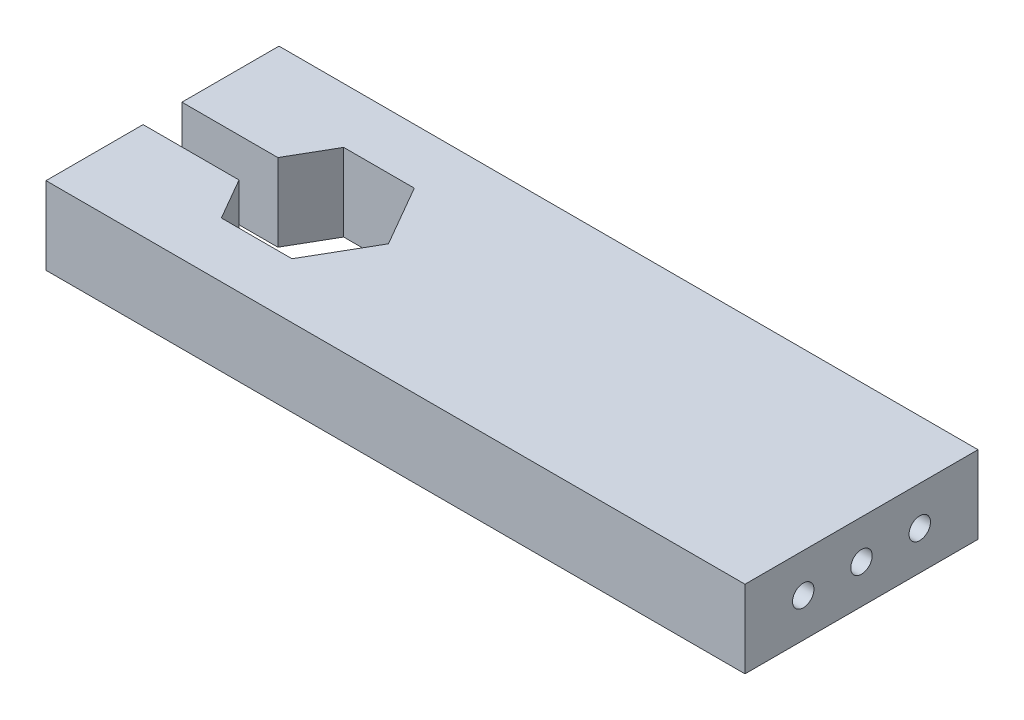
ISO-10303-21;
HEADER;
FILE_DESCRIPTION(('STEP AP214'),'2;1');
FILE_NAME('part.step','',(''),(''),'','','');
FILE_SCHEMA(('AUTOMOTIVE_DESIGN { 1 0 10303 214 1 1 1 1 }'));
ENDSEC;
DATA;
#1=APPLICATION_CONTEXT('core data for automotive mechanical design processes');
#2=APPLICATION_PROTOCOL_DEFINITION('international standard','automotive_design',2000,#1);
#3=PRODUCT_CONTEXT('',#1,'mechanical');
#4=PRODUCT('Part','Part','',(#3));
#5=PRODUCT_RELATED_PRODUCT_CATEGORY('part','',(#4));
#6=PRODUCT_DEFINITION_FORMATION('','',#4);
#7=PRODUCT_DEFINITION_CONTEXT('part definition',#1,'design');
#8=PRODUCT_DEFINITION('design','',#6,#7);
#9=PRODUCT_DEFINITION_SHAPE('','',#8);
#10=(LENGTH_UNIT() NAMED_UNIT(*) SI_UNIT(.MILLI.,.METRE.));
#11=(NAMED_UNIT(*) PLANE_ANGLE_UNIT() SI_UNIT($,.RADIAN.));
#12=(NAMED_UNIT(*) SI_UNIT($,.STERADIAN.) SOLID_ANGLE_UNIT());
#13=UNCERTAINTY_MEASURE_WITH_UNIT(LENGTH_MEASURE(1.E-05),#10,'distance_accuracy_value','');
#14=(GEOMETRIC_REPRESENTATION_CONTEXT(3) GLOBAL_UNCERTAINTY_ASSIGNED_CONTEXT((#13)) GLOBAL_UNIT_ASSIGNED_CONTEXT((#10,
#11,#12)) REPRESENTATION_CONTEXT('',''));
#15=CARTESIAN_POINT('',(0.,0.,0.));
#16=DIRECTION('',(0.,0.,1.));
#17=DIRECTION('',(1.,0.,0.));
#18=AXIS2_PLACEMENT_3D('',#15,#16,#17);
#19=CARTESIAN_POINT('',(-114.3,6.35,19.05));
#20=DIRECTION('',(1.,0.,0.));
#21=DIRECTION('',(0.,0.,-1.));
#22=AXIS2_PLACEMENT_3D('',#19,#20,#21);
#23=PLANE('',#22);
#24=DIRECTION('',(0.,0.,1.));
#25=VECTOR('',#24,1.);
#26=CARTESIAN_POINT('',(-114.3,6.35,19.05));
#27=LINE('',#26,#25);
#28=CARTESIAN_POINT('',(-114.3,6.35,3.17500000000001));
#29=VERTEX_POINT('',#28);
#30=CARTESIAN_POINT('',(-114.3,6.35,19.05));
#31=VERTEX_POINT('',#30);
#32=EDGE_CURVE('E173',#29,#31,#27,.T.);
#33=ORIENTED_EDGE('',*,*,#32,.F.);
#34=DIRECTION('',(0.,1.,0.));
#35=VECTOR('',#34,1.);
#36=CARTESIAN_POINT('',(-114.3,-6.35,3.17500000000001));
#37=LINE('',#36,#35);
#38=CARTESIAN_POINT('',(-114.3,-6.35,3.17500000000001));
#39=VERTEX_POINT('',#38);
#40=EDGE_CURVE('E144',#39,#29,#37,.T.);
#41=ORIENTED_EDGE('',*,*,#40,.F.);
#42=DIRECTION('',(0.,0.,1.));
#43=VECTOR('',#42,1.);
#44=CARTESIAN_POINT('',(-114.3,-6.35,19.05));
#45=LINE('',#44,#43);
#46=CARTESIAN_POINT('',(-114.3,-6.35,19.05));
#47=VERTEX_POINT('',#46);
#48=EDGE_CURVE('E161',#39,#47,#45,.T.);
#49=ORIENTED_EDGE('',*,*,#48,.T.);
#50=DIRECTION('',(0.,-1.,0.));
#51=VECTOR('',#50,1.);
#52=CARTESIAN_POINT('',(-114.3,6.35,19.05));
#53=LINE('',#52,#51);
#54=EDGE_CURVE('E181',#31,#47,#53,.T.);
#55=ORIENTED_EDGE('',*,*,#54,.F.);
#56=EDGE_LOOP('',(#33,#41,#49,#55));
#57=FACE_BOUND('',#56,.T.);
#58=ADVANCED_FACE('F35',(#57),#23,.F.);
#59=CARTESIAN_POINT('',(-114.3,-6.35,-19.05));
#60=VERTEX_POINT('',#59);
#61=CARTESIAN_POINT('',(-114.3,-6.35,-3.17499999999999));
#62=VERTEX_POINT('',#61);
#63=EDGE_CURVE('E153',#60,#62,#45,.T.);
#64=ORIENTED_EDGE('',*,*,#63,.T.);
#65=DIRECTION('',(0.,1.,0.));
#66=VECTOR('',#65,1.);
#67=CARTESIAN_POINT('',(-114.3,-6.35,-3.17499999999999));
#68=LINE('',#67,#66);
#69=CARTESIAN_POINT('',(-114.3,6.35,-3.17499999999999));
#70=VERTEX_POINT('',#69);
#71=EDGE_CURVE('E136',#62,#70,#68,.T.);
#72=ORIENTED_EDGE('',*,*,#71,.T.);
#73=CARTESIAN_POINT('',(-114.3,6.35,-19.05));
#74=VERTEX_POINT('',#73);
#75=EDGE_CURVE('E192',#74,#70,#27,.T.);
#76=ORIENTED_EDGE('',*,*,#75,.F.);
#77=DIRECTION('',(0.,-1.,0.));
#78=VECTOR('',#77,1.);
#79=CARTESIAN_POINT('',(-114.3,6.35,-19.05));
#80=LINE('',#79,#78);
#81=EDGE_CURVE('E159',#74,#60,#80,.T.);
#82=ORIENTED_EDGE('',*,*,#81,.T.);
#83=EDGE_LOOP('',(#64,#72,#76,#82));
#84=FACE_BOUND('',#83,.T.);
#85=ADVANCED_FACE('F37',(#84),#23,.F.);
#86=CARTESIAN_POINT('',(0.,6.35,19.05));
#87=DIRECTION('',(0.,0.,-1.));
#88=DIRECTION('',(-1.,0.,0.));
#89=AXIS2_PLACEMENT_3D('',#86,#87,#88);
#90=PLANE('',#89);
#91=DIRECTION('',(1.,0.,0.));
#92=VECTOR('',#91,1.);
#93=CARTESIAN_POINT('',(0.,-6.35,19.05));
#94=LINE('',#93,#92);
#95=CARTESIAN_POINT('',(0.,-6.35,19.05));
#96=VERTEX_POINT('',#95);
#97=EDGE_CURVE('E160',#47,#96,#94,.T.);
#98=ORIENTED_EDGE('',*,*,#97,.T.);
#99=DIRECTION('',(0.,-1.,0.));
#100=VECTOR('',#99,1.);
#101=CARTESIAN_POINT('',(0.,6.35,19.05));
#102=LINE('',#101,#100);
#103=CARTESIAN_POINT('',(0.,6.35,19.05));
#104=VERTEX_POINT('',#103);
#105=EDGE_CURVE('E178',#104,#96,#102,.T.);
#106=ORIENTED_EDGE('',*,*,#105,.F.);
#107=DIRECTION('',(1.,0.,0.));
#108=VECTOR('',#107,1.);
#109=CARTESIAN_POINT('',(0.,6.35,19.05));
#110=LINE('',#109,#108);
#111=EDGE_CURVE('E255',#31,#104,#110,.T.);
#112=ORIENTED_EDGE('',*,*,#111,.F.);
#113=ORIENTED_EDGE('',*,*,#54,.T.);
#114=EDGE_LOOP('',(#98,#106,#112,#113));
#115=FACE_BOUND('',#114,.T.);
#116=ADVANCED_FACE('F269',(#115),#90,.F.);
#117=CARTESIAN_POINT('',(0.,6.35,19.05));
#118=DIRECTION('',(-1.,0.,0.));
#119=DIRECTION('',(0.,0.,1.));
#120=AXIS2_PLACEMENT_3D('',#117,#118,#119);
#121=PLANE('',#120);
#122=CARTESIAN_POINT('',(0.,0.,0.));
#123=DIRECTION('',(1.,0.,0.));
#124=DIRECTION('',(0.,0.,-1.));
#125=AXIS2_PLACEMENT_3D('',#122,#123,#124);
#126=CIRCLE('',#125,1.75259999999999);
#127=CARTESIAN_POINT('',(0.,0.,-1.75259999999999));
#128=VERTEX_POINT('',#127);
#129=EDGE_CURVE('E237',#128,#128,#126,.T.);
#130=ORIENTED_EDGE('',*,*,#129,.F.);
#131=EDGE_LOOP('',(#130));
#132=FACE_BOUND('',#131,.T.);
#133=CARTESIAN_POINT('',(0.,0.,-9.525));
#134=DIRECTION('',(1.,0.,0.));
#135=DIRECTION('',(0.,0.,-1.));
#136=AXIS2_PLACEMENT_3D('',#133,#134,#135);
#137=CIRCLE('',#136,1.75259999999999);
#138=CARTESIAN_POINT('',(0.,0.,-11.2776));
#139=VERTEX_POINT('',#138);
#140=EDGE_CURVE('E243',#139,#139,#137,.T.);
#141=ORIENTED_EDGE('',*,*,#140,.F.);
#142=EDGE_LOOP('',(#141));
#143=FACE_BOUND('',#142,.T.);
#144=CARTESIAN_POINT('',(0.,0.,9.525));
#145=DIRECTION('',(1.,0.,0.));
#146=DIRECTION('',(0.,0.,-1.));
#147=AXIS2_PLACEMENT_3D('',#144,#145,#146);
#148=CIRCLE('',#147,1.75259999999999);
#149=CARTESIAN_POINT('',(0.,0.,7.77240000000001));
#150=VERTEX_POINT('',#149);
#151=EDGE_CURVE('E249',#150,#150,#148,.T.);
#152=ORIENTED_EDGE('',*,*,#151,.F.);
#153=EDGE_LOOP('',(#152));
#154=FACE_BOUND('',#153,.T.);
#155=DIRECTION('',(0.,0.,-1.));
#156=VECTOR('',#155,1.);
#157=CARTESIAN_POINT('',(0.,-6.35,19.05));
#158=LINE('',#157,#156);
#159=CARTESIAN_POINT('',(0.,-6.35,-19.05));
#160=VERTEX_POINT('',#159);
#161=EDGE_CURVE('E163',#96,#160,#158,.T.);
#162=ORIENTED_EDGE('',*,*,#161,.T.);
#163=DIRECTION('',(0.,-1.,0.));
#164=VECTOR('',#163,1.);
#165=CARTESIAN_POINT('',(0.,6.35,-19.05));
#166=LINE('',#165,#164);
#167=CARTESIAN_POINT('',(0.,6.35,-19.05));
#168=VERTEX_POINT('',#167);
#169=EDGE_CURVE('E175',#168,#160,#166,.T.);
#170=ORIENTED_EDGE('',*,*,#169,.F.);
#171=DIRECTION('',(0.,0.,-1.));
#172=VECTOR('',#171,1.);
#173=CARTESIAN_POINT('',(0.,6.35,19.05));
#174=LINE('',#173,#172);
#175=EDGE_CURVE('E256',#104,#168,#174,.T.);
#176=ORIENTED_EDGE('',*,*,#175,.F.);
#177=ORIENTED_EDGE('',*,*,#105,.T.);
#178=EDGE_LOOP('',(#162,#170,#176,#177));
#179=FACE_BOUND('',#178,.T.);
#180=ADVANCED_FACE('F265',(#132,#143,#154,#179),#121,.F.);
#181=CARTESIAN_POINT('',(0.,6.35,-19.05));
#182=DIRECTION('',(0.,0.,1.));
#183=DIRECTION('',(1.,0.,0.));
#184=AXIS2_PLACEMENT_3D('',#181,#182,#183);
#185=PLANE('',#184);
#186=DIRECTION('',(-1.,0.,0.));
#187=VECTOR('',#186,1.);
#188=CARTESIAN_POINT('',(0.,-6.35,-19.05));
#189=LINE('',#188,#187);
#190=EDGE_CURVE('E171',#160,#60,#189,.T.);
#191=ORIENTED_EDGE('',*,*,#190,.T.);
#192=ORIENTED_EDGE('',*,*,#81,.F.);
#193=DIRECTION('',(-1.,0.,0.));
#194=VECTOR('',#193,1.);
#195=CARTESIAN_POINT('',(0.,6.35,-19.05));
#196=LINE('',#195,#194);
#197=EDGE_CURVE('E167',#168,#74,#196,.T.);
#198=ORIENTED_EDGE('',*,*,#197,.F.);
#199=ORIENTED_EDGE('',*,*,#169,.T.);
#200=EDGE_LOOP('',(#191,#192,#198,#199));
#201=FACE_BOUND('',#200,.T.);
#202=ADVANCED_FACE('F261',(#201),#185,.F.);
#203=CARTESIAN_POINT('',(0.,6.35,0.));
#204=DIRECTION('',(0.,1.,0.));
#205=DIRECTION('',(0.,0.,1.));
#206=AXIS2_PLACEMENT_3D('',#203,#204,#205);
#207=PLANE('',#206);
#208=DIRECTION('',(1.,0.,0.));
#209=VECTOR('',#208,1.);
#210=CARTESIAN_POINT('',(-94.6735026918962,6.35,3.17500000000001));
#211=LINE('',#210,#209);
#212=CARTESIAN_POINT('',(-98.6139182791154,6.35,3.17500000000001));
#213=VERTEX_POINT('',#212);
#214=EDGE_CURVE('E50',#29,#213,#211,.T.);
#215=ORIENTED_EDGE('',*,*,#214,.F.);
#216=ORIENTED_EDGE('',*,*,#32,.T.);
#217=ORIENTED_EDGE('',*,*,#111,.T.);
#218=ORIENTED_EDGE('',*,*,#175,.T.);
#219=ORIENTED_EDGE('',*,*,#197,.T.);
#220=ORIENTED_EDGE('',*,*,#75,.T.);
#221=DIRECTION('',(-1.,0.,0.));
#222=VECTOR('',#221,1.);
#223=CARTESIAN_POINT('',(-94.6735026918962,6.35,-3.17499999999999));
#224=LINE('',#223,#222);
#225=CARTESIAN_POINT('',(-98.6139182791155,6.35,-3.17499999999999));
#226=VERTEX_POINT('',#225);
#227=EDGE_CURVE('E139',#226,#70,#224,.T.);
#228=ORIENTED_EDGE('',*,*,#227,.F.);
#229=DIRECTION('',(-0.5,0.,0.866025403784439));
#230=VECTOR('',#229,1.);
#231=CARTESIAN_POINT('',(-94.6735026918963,6.35,-9.99999999999998));
#232=LINE('',#231,#230);
#233=CARTESIAN_POINT('',(-94.6735026918963,6.35,-9.99999999999998));
#234=VERTEX_POINT('',#233);
#235=EDGE_CURVE('E188',#234,#226,#232,.T.);
#236=ORIENTED_EDGE('',*,*,#235,.F.);
#237=DIRECTION('',(-1.,0.,0.));
#238=VECTOR('',#237,1.);
#239=CARTESIAN_POINT('',(-83.1264973081038,6.35,-9.99999999999998));
#240=LINE('',#239,#238);
#241=CARTESIAN_POINT('',(-83.1264973081038,6.35,-9.99999999999998));
#242=VERTEX_POINT('',#241);
#243=EDGE_CURVE('E219',#242,#234,#240,.T.);
#244=ORIENTED_EDGE('',*,*,#243,.F.);
#245=DIRECTION('',(-0.5,0.,-0.866025403784439));
#246=VECTOR('',#245,1.);
#247=CARTESIAN_POINT('',(-77.3529946162075,6.35,0.));
#248=LINE('',#247,#246);
#249=CARTESIAN_POINT('',(-77.3529946162075,6.35,0.));
#250=VERTEX_POINT('',#249);
#251=EDGE_CURVE('E216',#250,#242,#248,.T.);
#252=ORIENTED_EDGE('',*,*,#251,.F.);
#253=DIRECTION('',(0.5,0.,-0.866025403784438));
#254=VECTOR('',#253,1.);
#255=CARTESIAN_POINT('',(-83.1264973081038,6.35,10.));
#256=LINE('',#255,#254);
#257=CARTESIAN_POINT('',(-83.1264973081038,6.35,10.));
#258=VERTEX_POINT('',#257);
#259=EDGE_CURVE('E213',#258,#250,#256,.T.);
#260=ORIENTED_EDGE('',*,*,#259,.F.);
#261=DIRECTION('',(1.,0.,0.));
#262=VECTOR('',#261,1.);
#263=CARTESIAN_POINT('',(-94.6735026918962,6.35,10.));
#264=LINE('',#263,#262);
#265=CARTESIAN_POINT('',(-94.6735026918962,6.35,10.));
#266=VERTEX_POINT('',#265);
#267=EDGE_CURVE('E197',#266,#258,#264,.T.);
#268=ORIENTED_EDGE('',*,*,#267,.F.);
#269=DIRECTION('',(0.500000000000001,0.,0.866025403784438));
#270=VECTOR('',#269,1.);
#271=CARTESIAN_POINT('',(-100.447005383793,6.35,0.));
#272=LINE('',#271,#270);
#273=EDGE_CURVE('E223',#213,#266,#272,.T.);
#274=ORIENTED_EDGE('',*,*,#273,.F.);
#275=EDGE_LOOP('',(#215,#216,#217,#218,#219,#220,#228,#236,#244,#252,#260,#268,#274));
#276=FACE_BOUND('',#275,.T.);
#277=ADVANCED_FACE('F190',(#276),#207,.T.);
#278=CARTESIAN_POINT('',(0.,-6.35,0.));
#279=DIRECTION('',(0.,1.,0.));
#280=DIRECTION('',(0.,0.,1.));
#281=AXIS2_PLACEMENT_3D('',#278,#279,#280);
#282=PLANE('',#281);
#283=ORIENTED_EDGE('',*,*,#48,.F.);
#284=DIRECTION('',(1.,0.,0.));
#285=VECTOR('',#284,1.);
#286=CARTESIAN_POINT('',(-94.6735026918962,-6.35,3.17500000000001));
#287=LINE('',#286,#285);
#288=CARTESIAN_POINT('',(-98.6139182791154,-6.35,3.17500000000001));
#289=VERTEX_POINT('',#288);
#290=EDGE_CURVE('E145',#39,#289,#287,.T.);
#291=ORIENTED_EDGE('',*,*,#290,.T.);
#292=DIRECTION('',(-0.500000000000001,0.,-0.866025403784438));
#293=VECTOR('',#292,1.);
#294=CARTESIAN_POINT('',(-100.447005383793,-6.35,0.));
#295=LINE('',#294,#293);
#296=CARTESIAN_POINT('',(-94.6735026918962,-6.35,10.));
#297=VERTEX_POINT('',#296);
#298=EDGE_CURVE('E206',#297,#289,#295,.T.);
#299=ORIENTED_EDGE('',*,*,#298,.F.);
#300=DIRECTION('',(-1.,0.,0.));
#301=VECTOR('',#300,1.);
#302=CARTESIAN_POINT('',(-94.6735026918962,-6.35,10.));
#303=LINE('',#302,#301);
#304=CARTESIAN_POINT('',(-83.1264973081038,-6.35,10.));
#305=VERTEX_POINT('',#304);
#306=EDGE_CURVE('E209',#305,#297,#303,.T.);
#307=ORIENTED_EDGE('',*,*,#306,.F.);
#308=DIRECTION('',(-0.5,0.,0.866025403784438));
#309=VECTOR('',#308,1.);
#310=CARTESIAN_POINT('',(-83.1264973081038,-6.35,10.));
#311=LINE('',#310,#309);
#312=CARTESIAN_POINT('',(-77.3529946162075,-6.35,0.));
#313=VERTEX_POINT('',#312);
#314=EDGE_CURVE('E211',#313,#305,#311,.T.);
#315=ORIENTED_EDGE('',*,*,#314,.F.);
#316=DIRECTION('',(0.5,0.,0.866025403784439));
#317=VECTOR('',#316,1.);
#318=CARTESIAN_POINT('',(-77.3529946162075,-6.35,0.));
#319=LINE('',#318,#317);
#320=CARTESIAN_POINT('',(-83.1264973081038,-6.35,-9.99999999999998));
#321=VERTEX_POINT('',#320);
#322=EDGE_CURVE('E199',#321,#313,#319,.T.);
#323=ORIENTED_EDGE('',*,*,#322,.F.);
#324=DIRECTION('',(1.,0.,0.));
#325=VECTOR('',#324,1.);
#326=CARTESIAN_POINT('',(-83.1264973081038,-6.35,-9.99999999999998));
#327=LINE('',#326,#325);
#328=CARTESIAN_POINT('',(-94.6735026918963,-6.35,-9.99999999999998));
#329=VERTEX_POINT('',#328);
#330=EDGE_CURVE('E202',#329,#321,#327,.T.);
#331=ORIENTED_EDGE('',*,*,#330,.F.);
#332=DIRECTION('',(0.5,0.,-0.866025403784439));
#333=VECTOR('',#332,1.);
#334=CARTESIAN_POINT('',(-94.6735026918963,-6.35,-9.99999999999998));
#335=LINE('',#334,#333);
#336=CARTESIAN_POINT('',(-98.6139182791155,-6.35,-3.17499999999999));
#337=VERTEX_POINT('',#336);
#338=EDGE_CURVE('E155',#337,#329,#335,.T.);
#339=ORIENTED_EDGE('',*,*,#338,.F.);
#340=DIRECTION('',(-1.,0.,0.));
#341=VECTOR('',#340,1.);
#342=CARTESIAN_POINT('',(-94.6735026918962,-6.35,-3.17499999999999));
#343=LINE('',#342,#341);
#344=EDGE_CURVE('E57',#337,#62,#343,.T.);
#345=ORIENTED_EDGE('',*,*,#344,.T.);
#346=ORIENTED_EDGE('',*,*,#63,.F.);
#347=ORIENTED_EDGE('',*,*,#190,.F.);
#348=ORIENTED_EDGE('',*,*,#161,.F.);
#349=ORIENTED_EDGE('',*,*,#97,.F.);
#350=EDGE_LOOP('',(#283,#291,#299,#307,#315,#323,#331,#339,#345,#346,#347,#348,#349));
#351=FACE_BOUND('',#350,.T.);
#352=ADVANCED_FACE('F151',(#351),#282,.F.);
#353=CARTESIAN_POINT('',(-50.8,0.,9.525));
#354=DIRECTION('',(1.,0.,0.));
#355=DIRECTION('',(0.,0.,-1.));
#356=AXIS2_PLACEMENT_3D('',#353,#354,#355);
#357=CONICAL_SURFACE('',#356,1.75259999999999,1.02974425867665);
#358=CARTESIAN_POINT('',(-51.8530683209077,0.,9.525));
#359=VERTEX_POINT('',#358);
#360=VERTEX_LOOP('',#359);
#361=FACE_BOUND('',#360,.T.);
#362=CARTESIAN_POINT('',(-50.8,0.,9.525));
#363=DIRECTION('',(1.,0.,0.));
#364=DIRECTION('',(0.,0.,-1.));
#365=AXIS2_PLACEMENT_3D('',#362,#363,#364);
#366=CIRCLE('',#365,1.75259999999999);
#367=CARTESIAN_POINT('',(-50.8,0.,7.77240000000001));
#368=VERTEX_POINT('',#367);
#369=EDGE_CURVE('E165',#368,#368,#366,.T.);
#370=ORIENTED_EDGE('',*,*,#369,.T.);
#371=EDGE_LOOP('',(#370));
#372=FACE_BOUND('',#371,.T.);
#373=ADVANCED_FACE('F321',(#361,#372),#357,.F.);
#374=CARTESIAN_POINT('',(0.,0.,9.525));
#375=DIRECTION('',(1.,0.,0.));
#376=DIRECTION('',(0.,0.,-1.));
#377=AXIS2_PLACEMENT_3D('',#374,#375,#376);
#378=CYLINDRICAL_SURFACE('',#377,1.75259999999999);
#379=ORIENTED_EDGE('',*,*,#369,.F.);
#380=EDGE_LOOP('',(#379));
#381=FACE_BOUND('',#380,.T.);
#382=ORIENTED_EDGE('',*,*,#151,.T.);
#383=EDGE_LOOP('',(#382));
#384=FACE_BOUND('',#383,.T.);
#385=ADVANCED_FACE('F326',(#381,#384),#378,.F.);
#386=CARTESIAN_POINT('',(-50.8,0.,-9.525));
#387=DIRECTION('',(1.,0.,0.));
#388=DIRECTION('',(0.,0.,-1.));
#389=AXIS2_PLACEMENT_3D('',#386,#387,#388);
#390=CONICAL_SURFACE('',#389,1.75259999999999,1.02974425867665);
#391=CARTESIAN_POINT('',(-51.8530683209077,0.,-9.525));
#392=VERTEX_POINT('',#391);
#393=VERTEX_LOOP('',#392);
#394=FACE_BOUND('',#393,.T.);
#395=CARTESIAN_POINT('',(-50.8,0.,-9.525));
#396=DIRECTION('',(1.,0.,0.));
#397=DIRECTION('',(0.,0.,-1.));
#398=AXIS2_PLACEMENT_3D('',#395,#396,#397);
#399=CIRCLE('',#398,1.75259999999999);
#400=CARTESIAN_POINT('',(-50.8,0.,-11.2776));
#401=VERTEX_POINT('',#400);
#402=EDGE_CURVE('E246',#401,#401,#399,.T.);
#403=ORIENTED_EDGE('',*,*,#402,.T.);
#404=EDGE_LOOP('',(#403));
#405=FACE_BOUND('',#404,.T.);
#406=ADVANCED_FACE('F330',(#394,#405),#390,.F.);
#407=CARTESIAN_POINT('',(0.,0.,-9.525));
#408=DIRECTION('',(1.,0.,0.));
#409=DIRECTION('',(0.,0.,-1.));
#410=AXIS2_PLACEMENT_3D('',#407,#408,#409);
#411=CYLINDRICAL_SURFACE('',#410,1.75259999999999);
#412=ORIENTED_EDGE('',*,*,#402,.F.);
#413=EDGE_LOOP('',(#412));
#414=FACE_BOUND('',#413,.T.);
#415=ORIENTED_EDGE('',*,*,#140,.T.);
#416=EDGE_LOOP('',(#415));
#417=FACE_BOUND('',#416,.T.);
#418=ADVANCED_FACE('F334',(#414,#417),#411,.F.);
#419=CARTESIAN_POINT('',(-50.8,0.,0.));
#420=DIRECTION('',(1.,0.,0.));
#421=DIRECTION('',(0.,0.,-1.));
#422=AXIS2_PLACEMENT_3D('',#419,#420,#421);
#423=CONICAL_SURFACE('',#422,1.75259999999999,1.02974425867665);
#424=CARTESIAN_POINT('',(-51.8530683209077,0.,0.));
#425=VERTEX_POINT('',#424);
#426=VERTEX_LOOP('',#425);
#427=FACE_BOUND('',#426,.T.);
#428=CARTESIAN_POINT('',(-50.8,0.,0.));
#429=DIRECTION('',(1.,0.,0.));
#430=DIRECTION('',(0.,0.,-1.));
#431=AXIS2_PLACEMENT_3D('',#428,#429,#430);
#432=CIRCLE('',#431,1.75259999999999);
#433=CARTESIAN_POINT('',(-50.8,0.,-1.75259999999999));
#434=VERTEX_POINT('',#433);
#435=EDGE_CURVE('E240',#434,#434,#432,.T.);
#436=ORIENTED_EDGE('',*,*,#435,.T.);
#437=EDGE_LOOP('',(#436));
#438=FACE_BOUND('',#437,.T.);
#439=ADVANCED_FACE('F338',(#427,#438),#423,.F.);
#440=CARTESIAN_POINT('',(0.,0.,0.));
#441=DIRECTION('',(1.,0.,0.));
#442=DIRECTION('',(0.,0.,-1.));
#443=AXIS2_PLACEMENT_3D('',#440,#441,#442);
#444=CYLINDRICAL_SURFACE('',#443,1.75259999999999);
#445=ORIENTED_EDGE('',*,*,#435,.F.);
#446=EDGE_LOOP('',(#445));
#447=FACE_BOUND('',#446,.T.);
#448=ORIENTED_EDGE('',*,*,#129,.T.);
#449=EDGE_LOOP('',(#448));
#450=FACE_BOUND('',#449,.T.);
#451=ADVANCED_FACE('F342',(#447,#450),#444,.F.);
#452=CARTESIAN_POINT('',(-94.6735026918962,-36.9005046330389,10.));
#453=DIRECTION('',(0.,0.,1.));
#454=DIRECTION('',(1.,0.,0.));
#455=AXIS2_PLACEMENT_3D('',#452,#453,#454);
#456=PLANE('',#455);
#457=ORIENTED_EDGE('',*,*,#306,.T.);
#458=DIRECTION('',(0.,1.,0.));
#459=VECTOR('',#458,1.);
#460=CARTESIAN_POINT('',(-94.6735026918962,-36.9005046330389,10.));
#461=LINE('',#460,#459);
#462=EDGE_CURVE('E203',#297,#266,#461,.T.);
#463=ORIENTED_EDGE('',*,*,#462,.T.);
#464=ORIENTED_EDGE('',*,*,#267,.T.);
#465=DIRECTION('',(0.,1.,0.));
#466=VECTOR('',#465,1.);
#467=CARTESIAN_POINT('',(-83.1264973081038,-36.9005046330389,10.));
#468=LINE('',#467,#466);
#469=EDGE_CURVE('E225',#305,#258,#468,.T.);
#470=ORIENTED_EDGE('',*,*,#469,.F.);
#471=EDGE_LOOP('',(#457,#463,#464,#470));
#472=FACE_BOUND('',#471,.T.);
#473=ADVANCED_FACE('F283',(#472),#456,.F.);
#474=CARTESIAN_POINT('',(-100.447005383793,-36.9005046330389,0.));
#475=DIRECTION('',(-0.866025403784438,0.,0.500000000000001));
#476=DIRECTION('',(0.500000000000001,0.,0.866025403784438));
#477=AXIS2_PLACEMENT_3D('',#474,#475,#476);
#478=PLANE('',#477);
#479=ORIENTED_EDGE('',*,*,#298,.T.);
#480=DIRECTION('',(0.,1.,0.));
#481=VECTOR('',#480,1.);
#482=CARTESIAN_POINT('',(-98.6139182791154,-36.9005046330389,3.17500000000001));
#483=LINE('',#482,#481);
#484=EDGE_CURVE('E11',#289,#213,#483,.T.);
#485=ORIENTED_EDGE('',*,*,#484,.T.);
#486=ORIENTED_EDGE('',*,*,#273,.T.);
#487=ORIENTED_EDGE('',*,*,#462,.F.);
#488=EDGE_LOOP('',(#479,#485,#486,#487));
#489=FACE_BOUND('',#488,.T.);
#490=ADVANCED_FACE('F279',(#489),#478,.F.);
#491=CARTESIAN_POINT('',(-94.6735026918963,-36.9005046330389,-9.99999999999998));
#492=DIRECTION('',(-0.866025403784439,0.,-0.5));
#493=DIRECTION('',(-0.5,0.,0.866025403784439));
#494=AXIS2_PLACEMENT_3D('',#491,#492,#493);
#495=PLANE('',#494);
#496=ORIENTED_EDGE('',*,*,#235,.T.);
#497=DIRECTION('',(0.,-1.,0.));
#498=VECTOR('',#497,1.);
#499=CARTESIAN_POINT('',(-98.6139182791155,-36.9005046330389,-3.17499999999999));
#500=LINE('',#499,#498);
#501=EDGE_CURVE('E43',#226,#337,#500,.T.);
#502=ORIENTED_EDGE('',*,*,#501,.T.);
#503=ORIENTED_EDGE('',*,*,#338,.T.);
#504=DIRECTION('',(0.,1.,0.));
#505=VECTOR('',#504,1.);
#506=CARTESIAN_POINT('',(-94.6735026918963,-36.9005046330389,-9.99999999999998));
#507=LINE('',#506,#505);
#508=EDGE_CURVE('E228',#329,#234,#507,.T.);
#509=ORIENTED_EDGE('',*,*,#508,.T.);
#510=EDGE_LOOP('',(#496,#502,#503,#509));
#511=FACE_BOUND('',#510,.T.);
#512=ADVANCED_FACE('F185',(#511),#495,.F.);
#513=CARTESIAN_POINT('',(-83.1264973081038,-36.9005046330389,-9.99999999999998));
#514=DIRECTION('',(0.,0.,-1.));
#515=DIRECTION('',(-1.,0.,0.));
#516=AXIS2_PLACEMENT_3D('',#513,#514,#515);
#517=PLANE('',#516);
#518=ORIENTED_EDGE('',*,*,#330,.T.);
#519=DIRECTION('',(0.,1.,0.));
#520=VECTOR('',#519,1.);
#521=CARTESIAN_POINT('',(-83.1264973081038,-36.9005046330389,-9.99999999999998));
#522=LINE('',#521,#520);
#523=EDGE_CURVE('E230',#321,#242,#522,.T.);
#524=ORIENTED_EDGE('',*,*,#523,.T.);
#525=ORIENTED_EDGE('',*,*,#243,.T.);
#526=ORIENTED_EDGE('',*,*,#508,.F.);
#527=EDGE_LOOP('',(#518,#524,#525,#526));
#528=FACE_BOUND('',#527,.T.);
#529=ADVANCED_FACE('F295',(#528),#517,.F.);
#530=CARTESIAN_POINT('',(-77.3529946162075,-36.9005046330389,0.));
#531=DIRECTION('',(0.866025403784438,0.,-0.5));
#532=DIRECTION('',(-0.5,0.,-0.866025403784439));
#533=AXIS2_PLACEMENT_3D('',#530,#531,#532);
#534=PLANE('',#533);
#535=ORIENTED_EDGE('',*,*,#322,.T.);
#536=DIRECTION('',(0.,1.,0.));
#537=VECTOR('',#536,1.);
#538=CARTESIAN_POINT('',(-77.3529946162075,-36.9005046330389,0.));
#539=LINE('',#538,#537);
#540=EDGE_CURVE('E232',#313,#250,#539,.T.);
#541=ORIENTED_EDGE('',*,*,#540,.T.);
#542=ORIENTED_EDGE('',*,*,#251,.T.);
#543=ORIENTED_EDGE('',*,*,#523,.F.);
#544=EDGE_LOOP('',(#535,#541,#542,#543));
#545=FACE_BOUND('',#544,.T.);
#546=ADVANCED_FACE('F293',(#545),#534,.F.);
#547=CARTESIAN_POINT('',(-83.1264973081038,-36.9005046330389,10.));
#548=DIRECTION('',(0.866025403784438,0.,0.5));
#549=DIRECTION('',(0.5,0.,-0.866025403784438));
#550=AXIS2_PLACEMENT_3D('',#547,#548,#549);
#551=PLANE('',#550);
#552=ORIENTED_EDGE('',*,*,#314,.T.);
#553=ORIENTED_EDGE('',*,*,#469,.T.);
#554=ORIENTED_EDGE('',*,*,#259,.T.);
#555=ORIENTED_EDGE('',*,*,#540,.F.);
#556=EDGE_LOOP('',(#552,#553,#554,#555));
#557=FACE_BOUND('',#556,.T.);
#558=ADVANCED_FACE('F288',(#557),#551,.F.);
#559=CARTESIAN_POINT('',(-94.6735026918962,-6.35,-3.17499999999999));
#560=DIRECTION('',(0.,0.,-1.));
#561=DIRECTION('',(-1.,0.,0.));
#562=AXIS2_PLACEMENT_3D('',#559,#560,#561);
#563=PLANE('',#562);
#564=ORIENTED_EDGE('',*,*,#227,.T.);
#565=ORIENTED_EDGE('',*,*,#71,.F.);
#566=ORIENTED_EDGE('',*,*,#344,.F.);
#567=ORIENTED_EDGE('',*,*,#501,.F.);
#568=EDGE_LOOP('',(#564,#565,#566,#567));
#569=FACE_BOUND('',#568,.T.);
#570=ADVANCED_FACE('F137',(#569),#563,.F.);
#571=CARTESIAN_POINT('',(-94.6735026918962,-6.35,3.17500000000001));
#572=DIRECTION('',(0.,0.,1.));
#573=DIRECTION('',(1.,0.,0.));
#574=AXIS2_PLACEMENT_3D('',#571,#572,#573);
#575=PLANE('',#574);
#576=ORIENTED_EDGE('',*,*,#290,.F.);
#577=ORIENTED_EDGE('',*,*,#40,.T.);
#578=ORIENTED_EDGE('',*,*,#214,.T.);
#579=ORIENTED_EDGE('',*,*,#484,.F.);
#580=EDGE_LOOP('',(#576,#577,#578,#579));
#581=FACE_BOUND('',#580,.T.);
#582=ADVANCED_FACE('F353',(#581),#575,.F.);
#583=CLOSED_SHELL('',(#58,#85,#116,#180,#202,#277,#352,#373,#385,#406,#418,#439,#451,#473,#490,
#512,#529,#546,#558,#570,#582));
#584=MANIFOLD_SOLID_BREP('B2',#583);
#585=ADVANCED_BREP_SHAPE_REPRESENTATION('',(#18,#584),#14);
#586=SHAPE_DEFINITION_REPRESENTATION(#9,#585);
ENDSEC;
END-ISO-10303-21;
